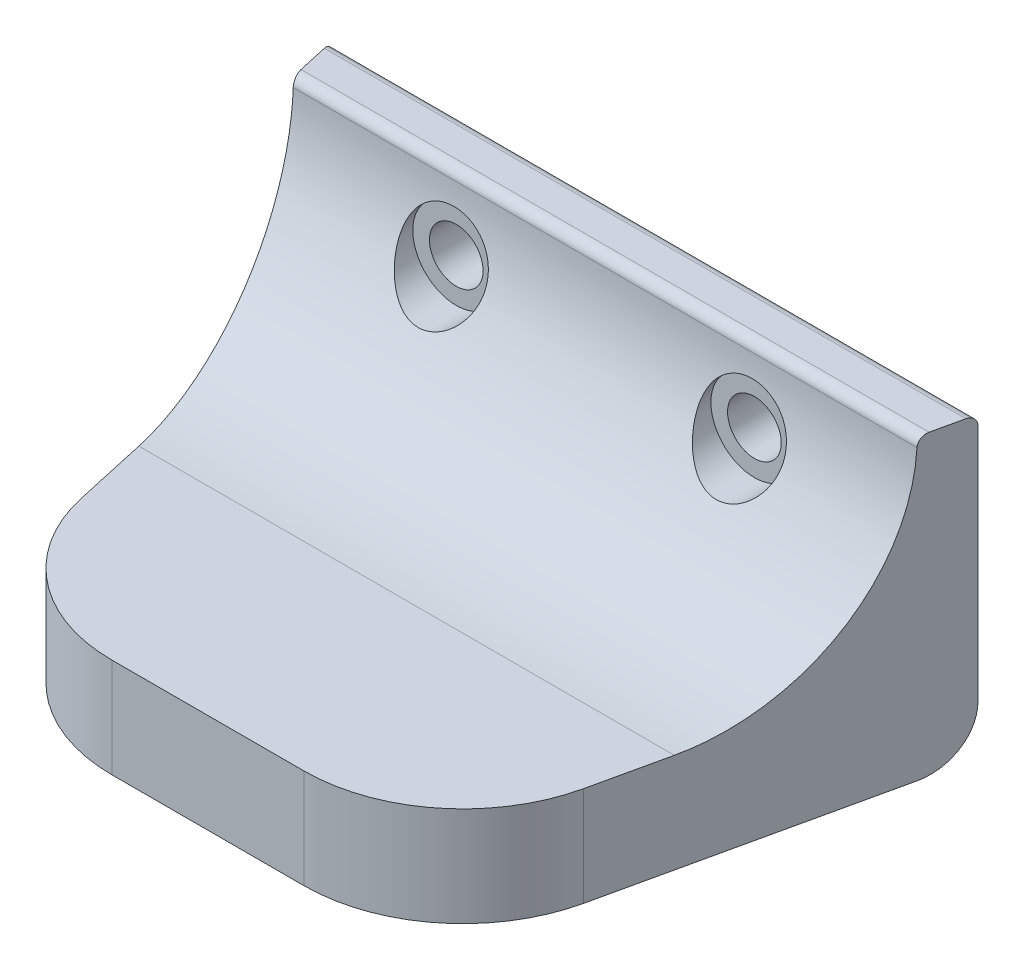
ISO-10303-21;
HEADER;
FILE_DESCRIPTION(('STEP AP214'),'2;1');
FILE_NAME('part.step','',(''),(''),'','','');
FILE_SCHEMA(('AUTOMOTIVE_DESIGN { 1 0 10303 214 1 1 1 1 }'));
ENDSEC;
DATA;
#1=APPLICATION_CONTEXT('core data for automotive mechanical design processes');
#2=APPLICATION_PROTOCOL_DEFINITION('international standard','automotive_design',2000,#1);
#3=PRODUCT_CONTEXT('',#1,'mechanical');
#4=PRODUCT('Part','Part','',(#3));
#5=PRODUCT_RELATED_PRODUCT_CATEGORY('part','',(#4));
#6=PRODUCT_DEFINITION_FORMATION('','',#4);
#7=PRODUCT_DEFINITION_CONTEXT('part definition',#1,'design');
#8=PRODUCT_DEFINITION('design','',#6,#7);
#9=PRODUCT_DEFINITION_SHAPE('','',#8);
#10=(LENGTH_UNIT() NAMED_UNIT(*) SI_UNIT(.MILLI.,.METRE.));
#11=(NAMED_UNIT(*) PLANE_ANGLE_UNIT() SI_UNIT($,.RADIAN.));
#12=(NAMED_UNIT(*) SI_UNIT($,.STERADIAN.) SOLID_ANGLE_UNIT());
#13=UNCERTAINTY_MEASURE_WITH_UNIT(LENGTH_MEASURE(1.E-05),#10,'distance_accuracy_value','');
#14=(GEOMETRIC_REPRESENTATION_CONTEXT(3) GLOBAL_UNCERTAINTY_ASSIGNED_CONTEXT((#13)) GLOBAL_UNIT_ASSIGNED_CONTEXT((#10,
#11,#12)) REPRESENTATION_CONTEXT('',''));
#15=CARTESIAN_POINT('',(0.,0.,0.));
#16=DIRECTION('',(0.,0.,1.));
#17=DIRECTION('',(1.,0.,0.));
#18=AXIS2_PLACEMENT_3D('',#15,#16,#17);
#19=CARTESIAN_POINT('',(0.,12.7,0.));
#20=DIRECTION('',(0.,1.,0.));
#21=DIRECTION('',(0.,0.,1.));
#22=AXIS2_PLACEMENT_3D('',#19,#20,#21);
#23=PLANE('',#22);
#24=DIRECTION('',(1.,0.,0.));
#25=VECTOR('',#24,1.);
#26=CARTESIAN_POINT('',(0.,12.7,28.575));
#27=LINE('',#26,#25);
#28=CARTESIAN_POINT('',(-12.2748729586454,12.7,28.575));
#29=VERTEX_POINT('',#28);
#30=CARTESIAN_POINT('',(12.2748729586454,12.7,28.575));
#31=VERTEX_POINT('',#30);
#32=EDGE_CURVE('E306',#29,#31,#27,.T.);
#33=ORIENTED_EDGE('',*,*,#32,.T.);
#34=CARTESIAN_POINT('',(12.2748729586454,12.7,8.25499999999998));
#35=DIRECTION('',(0.,1.,0.));
#36=DIRECTION('',(0.,0.,1.));
#37=AXIS2_PLACEMENT_3D('',#34,#35,#36);
#38=CIRCLE('',#37,20.32);
#39=CARTESIAN_POINT('',(32.1109940215833,12.7,12.6630269028751));
#40=VERTEX_POINT('',#39);
#41=EDGE_CURVE('E149',#31,#40,#38,.T.);
#42=ORIENTED_EDGE('',*,*,#41,.T.);
#43=DIRECTION('',(0.216930457818656,0.,-0.976187060183953));
#44=VECTOR('',#43,1.);
#45=CARTESIAN_POINT('',(33.2814705882353,12.7,7.39588235294117));
#46=LINE('',#45,#44);
#47=CARTESIAN_POINT('',(34.2194444444444,12.7,3.17499999999999));
#48=VERTEX_POINT('',#47);
#49=EDGE_CURVE('E135',#40,#48,#46,.T.);
#50=ORIENTED_EDGE('',*,*,#49,.T.);
#51=DIRECTION('',(-1.,0.,0.));
#52=VECTOR('',#51,1.);
#53=CARTESIAN_POINT('',(0.,12.7,3.17499999999999));
#54=LINE('',#53,#52);
#55=CARTESIAN_POINT('',(-34.2194444444444,12.7,3.17499999999999));
#56=VERTEX_POINT('',#55);
#57=EDGE_CURVE('E146',#48,#56,#54,.T.);
#58=ORIENTED_EDGE('',*,*,#57,.T.);
#59=DIRECTION('',(0.216930457818656,0.,0.976187060183953));
#60=VECTOR('',#59,1.);
#61=CARTESIAN_POINT('',(-33.2814705882353,12.7,7.39588235294118));
#62=LINE('',#61,#60);
#63=CARTESIAN_POINT('',(-32.1109940215833,12.7,12.6630269028751));
#64=VERTEX_POINT('',#63);
#65=EDGE_CURVE('E150',#56,#64,#62,.T.);
#66=ORIENTED_EDGE('',*,*,#65,.T.);
#67=CARTESIAN_POINT('',(-12.2748729586454,12.7,8.25499999999998));
#68=DIRECTION('',(0.,1.,0.));
#69=DIRECTION('',(0.,0.,1.));
#70=AXIS2_PLACEMENT_3D('',#67,#68,#69);
#71=CIRCLE('',#70,20.32);
#72=EDGE_CURVE('E172',#64,#29,#71,.T.);
#73=ORIENTED_EDGE('',*,*,#72,.T.);
#74=EDGE_LOOP('',(#33,#42,#50,#58,#66,#73));
#75=FACE_BOUND('',#74,.T.);
#76=ADVANCED_FACE('F44',(#75),#23,.T.);
#77=CARTESIAN_POINT('',(33.2814705882353,12.7,7.39588235294117));
#78=DIRECTION('',(-0.976187060183953,0.,-0.216930457818656));
#79=DIRECTION('',(-0.216930457818656,0.,0.976187060183953));
#80=AXIS2_PLACEMENT_3D('',#77,#78,#79);
#81=PLANE('',#80);
#82=DIRECTION('',(0.216930457818656,0.,-0.976187060183953));
#83=VECTOR('',#82,1.);
#84=CARTESIAN_POINT('',(33.2814705882353,38.1,7.39588235294117));
#85=LINE('',#84,#83);
#86=CARTESIAN_POINT('',(40.1393877207826,38.1,-23.4647447435219));
#87=VERTEX_POINT('',#86);
#88=CARTESIAN_POINT('',(40.9927777777778,38.1,-27.305));
#89=VERTEX_POINT('',#88);
#90=EDGE_CURVE('E296',#87,#89,#85,.T.);
#91=ORIENTED_EDGE('',*,*,#90,.F.);
#92=CARTESIAN_POINT('',(40.1393877207826,36.83,-23.4647447435219));
#93=DIRECTION('',(-0.976187060183953,0.,-0.216930457818656));
#94=DIRECTION('',(-0.216930457818656,0.,0.976187060183953));
#95=AXIS2_PLACEMENT_3D('',#92,#93,#94);
#96=ELLIPSE('',#95,1.30098016230688,1.27);
#97=CARTESIAN_POINT('',(39.8574856600046,36.8904761904762,-22.1961854700208));
#98=VERTEX_POINT('',#97);
#99=EDGE_CURVE('E137',#87,#98,#96,.F.);
#100=ORIENTED_EDGE('',*,*,#99,.T.);
#101=CARTESIAN_POINT('',(34.2194444444444,38.1,3.17499999999999));
#102=DIRECTION('',(-0.976187060183953,0.,-0.216930457818656));
#103=DIRECTION('',(-0.216930457818656,0.,0.976187060183953));
#104=AXIS2_PLACEMENT_3D('',#101,#102,#103);
#105=ELLIPSE('',#104,26.0196032461377,25.4);
#106=EDGE_CURVE('E130',#98,#48,#105,.T.);
#107=ORIENTED_EDGE('',*,*,#106,.T.);
#108=ORIENTED_EDGE('',*,*,#49,.F.);
#109=DIRECTION('',(0.,-1.,0.));
#110=VECTOR('',#109,1.);
#111=CARTESIAN_POINT('',(32.1109940215833,12.7,12.6630269028751));
#112=LINE('',#111,#110);
#113=CARTESIAN_POINT('',(32.1109940215833,0.,12.6630269028751));
#114=VERTEX_POINT('',#113);
#115=EDGE_CURVE('E139',#40,#114,#112,.T.);
#116=ORIENTED_EDGE('',*,*,#115,.T.);
#117=DIRECTION('',(0.216930457818656,0.,-0.976187060183953));
#118=VECTOR('',#117,1.);
#119=CARTESIAN_POINT('',(33.2814705882353,0.,7.39588235294117));
#120=LINE('',#119,#118);
#121=CARTESIAN_POINT('',(39.8638888888889,0.,-22.225));
#122=VERTEX_POINT('',#121);
#123=EDGE_CURVE('E299',#114,#122,#120,.T.);
#124=ORIENTED_EDGE('',*,*,#123,.T.);
#125=CARTESIAN_POINT('',(39.8638888888889,6.35,-22.225));
#126=DIRECTION('',(-0.976187060183953,0.,-0.216930457818656));
#127=DIRECTION('',(-0.216930457818656,0.,0.976187060183953));
#128=AXIS2_PLACEMENT_3D('',#125,#126,#127);
#129=ELLIPSE('',#128,6.50490081153443,6.35);
#130=CARTESIAN_POINT('',(41.275,6.35,-28.575));
#131=VERTEX_POINT('',#130);
#132=EDGE_CURVE('E180',#122,#131,#129,.F.);
#133=ORIENTED_EDGE('',*,*,#132,.T.);
#134=DIRECTION('',(0.,-1.,0.));
#135=VECTOR('',#134,1.);
#136=CARTESIAN_POINT('',(41.275,12.7,-28.575));
#137=LINE('',#136,#135);
#138=CARTESIAN_POINT('',(41.275,36.83,-28.575));
#139=VERTEX_POINT('',#138);
#140=EDGE_CURVE('E154',#139,#131,#137,.T.);
#141=ORIENTED_EDGE('',*,*,#140,.F.);
#142=CARTESIAN_POINT('',(40.9927777777778,36.83,-27.305));
#143=DIRECTION('',(-0.976187060183953,0.,-0.216930457818656));
#144=DIRECTION('',(0.216930457818656,0.,-0.976187060183953));
#145=AXIS2_PLACEMENT_3D('',#142,#143,#144);
#146=ELLIPSE('',#145,1.30098016230688,1.27);
#147=EDGE_CURVE('E193',#139,#89,#146,.F.);
#148=ORIENTED_EDGE('',*,*,#147,.T.);
#149=EDGE_LOOP('',(#91,#100,#107,#108,#116,#124,#133,#141,#148));
#150=FACE_BOUND('',#149,.T.);
#151=ADVANCED_FACE('F133',(#150),#81,.F.);
#152=CARTESIAN_POINT('',(0.,12.7,-28.575));
#153=DIRECTION('',(0.,0.,-1.));
#154=DIRECTION('',(-1.,0.,0.));
#155=AXIS2_PLACEMENT_3D('',#152,#153,#154);
#156=PLANE('',#155);
#157=CARTESIAN_POINT('',(19.05,28.702,-28.575));
#158=DIRECTION('',(0.,0.,-1.));
#159=DIRECTION('',(-1.,0.,0.));
#160=AXIS2_PLACEMENT_3D('',#157,#158,#159);
#161=CIRCLE('',#160,3.429);
#162=CARTESIAN_POINT('',(15.621,28.702,-28.575));
#163=VERTEX_POINT('',#162);
#164=EDGE_CURVE('E297',#163,#163,#161,.T.);
#165=ORIENTED_EDGE('',*,*,#164,.F.);
#166=EDGE_LOOP('',(#165));
#167=FACE_BOUND('',#166,.T.);
#168=CARTESIAN_POINT('',(-19.05,28.702,-28.575));
#169=DIRECTION('',(0.,0.,-1.));
#170=DIRECTION('',(1.,0.,0.));
#171=AXIS2_PLACEMENT_3D('',#168,#169,#170);
#172=CIRCLE('',#171,3.429);
#173=CARTESIAN_POINT('',(-15.621,28.702,-28.575));
#174=VERTEX_POINT('',#173);
#175=EDGE_CURVE('E204',#174,#174,#172,.T.);
#176=ORIENTED_EDGE('',*,*,#175,.F.);
#177=EDGE_LOOP('',(#176));
#178=FACE_BOUND('',#177,.T.);
#179=DIRECTION('',(0.,-1.,0.));
#180=VECTOR('',#179,1.);
#181=CARTESIAN_POINT('',(-41.275,12.7,-28.575));
#182=LINE('',#181,#180);
#183=CARTESIAN_POINT('',(-41.275,36.83,-28.575));
#184=VERTEX_POINT('',#183);
#185=CARTESIAN_POINT('',(-41.275,6.35,-28.575));
#186=VERTEX_POINT('',#185);
#187=EDGE_CURVE('E157',#184,#186,#182,.T.);
#188=ORIENTED_EDGE('',*,*,#187,.F.);
#189=DIRECTION('',(1.,0.,0.));
#190=VECTOR('',#189,1.);
#191=CARTESIAN_POINT('',(0.,36.83,-28.575));
#192=LINE('',#191,#190);
#193=EDGE_CURVE('E11',#184,#139,#192,.T.);
#194=ORIENTED_EDGE('',*,*,#193,.T.);
#195=ORIENTED_EDGE('',*,*,#140,.T.);
#196=DIRECTION('',(1.,0.,0.));
#197=VECTOR('',#196,1.);
#198=CARTESIAN_POINT('',(-41.275,6.35,-28.575));
#199=LINE('',#198,#197);
#200=EDGE_CURVE('E183',#131,#186,#199,.F.);
#201=ORIENTED_EDGE('',*,*,#200,.T.);
#202=EDGE_LOOP('',(#188,#194,#195,#201));
#203=FACE_BOUND('',#202,.T.);
#204=ADVANCED_FACE('F248',(#167,#178,#203),#156,.T.);
#205=CARTESIAN_POINT('',(-33.2814705882353,12.7,7.39588235294118));
#206=DIRECTION('',(0.976187060183953,0.,-0.216930457818656));
#207=DIRECTION('',(-0.216930457818656,0.,-0.976187060183953));
#208=AXIS2_PLACEMENT_3D('',#205,#206,#207);
#209=PLANE('',#208);
#210=CARTESIAN_POINT('',(-34.2194444444444,38.1,3.17499999999999));
#211=DIRECTION('',(0.976187060183953,0.,-0.216930457818656));
#212=DIRECTION('',(-0.216930457818656,0.,-0.976187060183953));
#213=AXIS2_PLACEMENT_3D('',#210,#211,#212);
#214=ELLIPSE('',#213,26.0196032461377,25.4);
#215=CARTESIAN_POINT('',(-39.8574856600046,36.8904761904762,-22.1961854700208));
#216=VERTEX_POINT('',#215);
#217=EDGE_CURVE('E140',#56,#216,#214,.T.);
#218=ORIENTED_EDGE('',*,*,#217,.T.);
#219=CARTESIAN_POINT('',(-40.1393877207826,36.83,-23.4647447435219));
#220=DIRECTION('',(0.976187060183953,0.,-0.216930457818656));
#221=DIRECTION('',(-0.216930457818656,0.,-0.976187060183953));
#222=AXIS2_PLACEMENT_3D('',#219,#220,#221);
#223=ELLIPSE('',#222,1.30098016230688,1.27);
#224=CARTESIAN_POINT('',(-40.1393877207826,38.1,-23.4647447435219));
#225=VERTEX_POINT('',#224);
#226=EDGE_CURVE('E53',#216,#225,#223,.F.);
#227=ORIENTED_EDGE('',*,*,#226,.T.);
#228=DIRECTION('',(0.216930457818656,0.,0.976187060183953));
#229=VECTOR('',#228,1.);
#230=CARTESIAN_POINT('',(-33.2814705882353,38.1,7.39588235294118));
#231=LINE('',#230,#229);
#232=CARTESIAN_POINT('',(-40.9927777777778,38.1,-27.305));
#233=VERTEX_POINT('',#232);
#234=EDGE_CURVE('E292',#233,#225,#231,.T.);
#235=ORIENTED_EDGE('',*,*,#234,.F.);
#236=CARTESIAN_POINT('',(-40.9927777777778,36.83,-27.305));
#237=DIRECTION('',(0.976187060183953,0.,-0.216930457818656));
#238=DIRECTION('',(0.216930457818656,0.,0.976187060183953));
#239=AXIS2_PLACEMENT_3D('',#236,#237,#238);
#240=ELLIPSE('',#239,1.30098016230688,1.27);
#241=EDGE_CURVE('E61',#233,#184,#240,.F.);
#242=ORIENTED_EDGE('',*,*,#241,.T.);
#243=ORIENTED_EDGE('',*,*,#187,.T.);
#244=CARTESIAN_POINT('',(-39.8638888888889,6.35,-22.225));
#245=DIRECTION('',(0.976187060183953,0.,-0.216930457818656));
#246=DIRECTION('',(-0.216930457818656,0.,-0.976187060183953));
#247=AXIS2_PLACEMENT_3D('',#244,#245,#246);
#248=ELLIPSE('',#247,6.50490081153443,6.35);
#249=CARTESIAN_POINT('',(-39.8638888888889,0.,-22.225));
#250=VERTEX_POINT('',#249);
#251=EDGE_CURVE('E186',#186,#250,#248,.F.);
#252=ORIENTED_EDGE('',*,*,#251,.T.);
#253=DIRECTION('',(0.216930457818656,0.,0.976187060183953));
#254=VECTOR('',#253,1.);
#255=CARTESIAN_POINT('',(-33.2814705882353,0.,7.39588235294118));
#256=LINE('',#255,#254);
#257=CARTESIAN_POINT('',(-32.1109940215833,0.,12.6630269028751));
#258=VERTEX_POINT('',#257);
#259=EDGE_CURVE('E310',#250,#258,#256,.T.);
#260=ORIENTED_EDGE('',*,*,#259,.T.);
#261=DIRECTION('',(0.,-1.,0.));
#262=VECTOR('',#261,1.);
#263=CARTESIAN_POINT('',(-32.1109940215833,12.7,12.6630269028751));
#264=LINE('',#263,#262);
#265=EDGE_CURVE('E175',#258,#64,#264,.F.);
#266=ORIENTED_EDGE('',*,*,#265,.T.);
#267=ORIENTED_EDGE('',*,*,#65,.F.);
#268=EDGE_LOOP('',(#218,#227,#235,#242,#243,#252,#260,#266,#267));
#269=FACE_BOUND('',#268,.T.);
#270=ADVANCED_FACE('F261',(#269),#209,.F.);
#271=CARTESIAN_POINT('',(0.,12.7,28.575));
#272=DIRECTION('',(0.,0.,-1.));
#273=DIRECTION('',(-1.,0.,0.));
#274=AXIS2_PLACEMENT_3D('',#271,#272,#273);
#275=PLANE('',#274);
#276=DIRECTION('',(1.,0.,0.));
#277=VECTOR('',#276,1.);
#278=CARTESIAN_POINT('',(0.,0.,28.575));
#279=LINE('',#278,#277);
#280=CARTESIAN_POINT('',(-12.2748729586454,0.,28.575));
#281=VERTEX_POINT('',#280);
#282=CARTESIAN_POINT('',(12.2748729586454,0.,28.575));
#283=VERTEX_POINT('',#282);
#284=EDGE_CURVE('E151',#281,#283,#279,.T.);
#285=ORIENTED_EDGE('',*,*,#284,.T.);
#286=DIRECTION('',(0.,-1.,0.));
#287=VECTOR('',#286,1.);
#288=CARTESIAN_POINT('',(12.2748729586454,12.7,28.575));
#289=LINE('',#288,#287);
#290=EDGE_CURVE('E170',#283,#31,#289,.F.);
#291=ORIENTED_EDGE('',*,*,#290,.T.);
#292=ORIENTED_EDGE('',*,*,#32,.F.);
#293=DIRECTION('',(0.,-1.,0.));
#294=VECTOR('',#293,1.);
#295=CARTESIAN_POINT('',(-12.2748729586454,12.7,28.575));
#296=LINE('',#295,#294);
#297=EDGE_CURVE('E167',#29,#281,#296,.T.);
#298=ORIENTED_EDGE('',*,*,#297,.T.);
#299=EDGE_LOOP('',(#285,#291,#292,#298));
#300=FACE_BOUND('',#299,.T.);
#301=ADVANCED_FACE('F257',(#300),#275,.F.);
#302=CARTESIAN_POINT('',(0.,0.,0.));
#303=DIRECTION('',(0.,1.,0.));
#304=DIRECTION('',(0.,0.,1.));
#305=AXIS2_PLACEMENT_3D('',#302,#303,#304);
#306=PLANE('',#305);
#307=ORIENTED_EDGE('',*,*,#259,.F.);
#308=DIRECTION('',(1.,0.,0.));
#309=VECTOR('',#308,1.);
#310=CARTESIAN_POINT('',(41.275,0.,-22.225));
#311=LINE('',#310,#309);
#312=EDGE_CURVE('E177',#250,#122,#311,.T.);
#313=ORIENTED_EDGE('',*,*,#312,.T.);
#314=ORIENTED_EDGE('',*,*,#123,.F.);
#315=CARTESIAN_POINT('',(12.2748729586454,0.,8.25499999999998));
#316=DIRECTION('',(0.,1.,0.));
#317=DIRECTION('',(0.,0.,1.));
#318=AXIS2_PLACEMENT_3D('',#315,#316,#317);
#319=CIRCLE('',#318,20.32);
#320=EDGE_CURVE('E165',#114,#283,#319,.F.);
#321=ORIENTED_EDGE('',*,*,#320,.T.);
#322=ORIENTED_EDGE('',*,*,#284,.F.);
#323=CARTESIAN_POINT('',(-12.2748729586454,0.,8.25499999999998));
#324=DIRECTION('',(0.,1.,0.));
#325=DIRECTION('',(0.,0.,1.));
#326=AXIS2_PLACEMENT_3D('',#323,#324,#325);
#327=CIRCLE('',#326,20.32);
#328=EDGE_CURVE('E162',#281,#258,#327,.F.);
#329=ORIENTED_EDGE('',*,*,#328,.T.);
#330=EDGE_LOOP('',(#307,#313,#314,#321,#322,#329));
#331=FACE_BOUND('',#330,.T.);
#332=ADVANCED_FACE('F254',(#331),#306,.F.);
#333=CARTESIAN_POINT('',(0.,38.1,0.));
#334=DIRECTION('',(0.,1.,0.));
#335=DIRECTION('',(0.,0.,1.));
#336=AXIS2_PLACEMENT_3D('',#333,#334,#335);
#337=PLANE('',#336);
#338=ORIENTED_EDGE('',*,*,#234,.T.);
#339=DIRECTION('',(1.,0.,0.));
#340=VECTOR('',#339,1.);
#341=CARTESIAN_POINT('',(39.8638888888889,38.1,-23.4647447435219));
#342=LINE('',#341,#340);
#343=EDGE_CURVE('E190',#225,#87,#342,.T.);
#344=ORIENTED_EDGE('',*,*,#343,.T.);
#345=ORIENTED_EDGE('',*,*,#90,.T.);
#346=DIRECTION('',(1.,0.,0.));
#347=VECTOR('',#346,1.);
#348=CARTESIAN_POINT('',(0.,38.1,-27.305));
#349=LINE('',#348,#347);
#350=EDGE_CURVE('E188',#89,#233,#349,.F.);
#351=ORIENTED_EDGE('',*,*,#350,.T.);
#352=EDGE_LOOP('',(#338,#344,#345,#351));
#353=FACE_BOUND('',#352,.T.);
#354=ADVANCED_FACE('F252',(#353),#337,.T.);
#355=CARTESIAN_POINT('',(0.,38.1,3.17499999999999));
#356=DIRECTION('',(-1.,0.,0.));
#357=DIRECTION('',(0.,0.,1.));
#358=AXIS2_PLACEMENT_3D('',#355,#356,#357);
#359=CYLINDRICAL_SURFACE('',#358,25.4);
#360=CARTESIAN_POINT('',(13.49375,28.702,-20.4224065524159));
#361=CARTESIAN_POINT('',(13.4937444494878,28.5302184618122,-20.3539959532494));
#362=CARTESIAN_POINT('',(13.5017148638482,28.3592541904367,-20.2837264938944));
#363=CARTESIAN_POINT('',(13.5331301185644,28.0200504016366,-20.1399844292932));
#364=CARTESIAN_POINT('',(13.5565780487582,27.8518114351477,-20.0665111871991));
#365=CARTESIAN_POINT('',(13.6184701275267,27.5191898144611,-19.9169843758128));
#366=CARTESIAN_POINT('',(13.6569225163623,27.3548093319745,-19.840929409661));
#367=CARTESIAN_POINT('',(13.7483147894845,27.0309615228968,-19.6869455063896));
#368=CARTESIAN_POINT('',(13.8012599585243,26.8714960121824,-19.6090158951592));
#369=CARTESIAN_POINT('',(13.9209736189234,26.558888429348,-19.4522669284419));
#370=CARTESIAN_POINT('',(13.9877038763128,26.4057302434337,-19.3734505922408));
#371=CARTESIAN_POINT('',(14.1345563425359,26.1061980982511,-19.2155665433379));
#372=CARTESIAN_POINT('',(14.2146786243542,25.9598241759615,-19.1364988292684));
#373=CARTESIAN_POINT('',(14.4746963441058,25.5318593076544,-18.9000428880382));
#374=CARTESIAN_POINT('',(14.6742795747111,25.2613290628421,-18.7433531241214));
#375=CARTESIAN_POINT('',(15.0135795293002,24.8797574720787,-18.5139016749672));
#376=CARTESIAN_POINT('',(15.1355753101583,24.7548529014055,-18.4371952439769));
#377=CARTESIAN_POINT('',(15.3922149746672,24.515925334156,-18.2878208923157));
#378=CARTESIAN_POINT('',(15.5268604070064,24.4019036734209,-18.2151534678756));
#379=CARTESIAN_POINT('',(15.8080140313002,24.1861600513116,-18.0754489563039));
#380=CARTESIAN_POINT('',(15.9545045283568,24.0844202892612,-18.0084037647667));
#381=CARTESIAN_POINT('',(16.2588194257235,23.8943634582273,-17.8814228593499));
#382=CARTESIAN_POINT('',(16.4166391018655,23.8060408417406,-17.8214842094355));
#383=CARTESIAN_POINT('',(16.6973776052897,23.6666869849142,-17.7258255909475));
#384=CARTESIAN_POINT('',(16.8178323138342,23.6121078917917,-17.6879999027999));
#385=CARTESIAN_POINT('',(17.0636387481768,23.5112467075538,-17.6175962668331));
#386=CARTESIAN_POINT('',(17.1889893092254,23.4649626574715,-17.5850170801789));
#387=CARTESIAN_POINT('',(17.4439030775,23.38125248704,-17.5257513000577));
#388=CARTESIAN_POINT('',(17.5734640592822,23.3438217711094,-17.4990616499394));
#389=CARTESIAN_POINT('',(17.8360175501231,23.2783060794521,-17.4521426801464));
#390=CARTESIAN_POINT('',(17.9690084113732,23.2502167028046,-17.4319103184754));
#391=CARTESIAN_POINT('',(18.2382611051441,23.2036587287409,-17.3982799824167));
#392=CARTESIAN_POINT('',(18.3745365301234,23.185241867996,-17.3849187684126));
#393=CARTESIAN_POINT('',(18.6486001068515,23.1585582446874,-17.3655353445589));
#394=CARTESIAN_POINT('',(18.7863882525643,23.1502914416374,-17.3595131054358));
#395=CARTESIAN_POINT('',(19.0623115778357,23.144050396433,-17.3549680175706));
#396=CARTESIAN_POINT('',(19.2004467304546,23.1460753785456,-17.3564446036123));
#397=CARTESIAN_POINT('',(19.4758940982375,23.160380411175,-17.3668559035917));
#398=CARTESIAN_POINT('',(19.6132063520592,23.1726599760927,-17.3757902643714));
#399=CARTESIAN_POINT('',(19.8751005473088,23.2058976981353,-17.3998900471001));
#400=CARTESIAN_POINT('',(19.9998307450887,23.2260930504078,-17.4145070533208));
#401=CARTESIAN_POINT('',(20.2468592900027,23.2747249297016,-17.4495510743075));
#402=CARTESIAN_POINT('',(20.3691568017904,23.3031642370921,-17.4699800491838));
#403=CARTESIAN_POINT('',(20.7312360944386,23.4003324938538,-17.5393955336426));
#404=CARTESIAN_POINT('',(20.9663986527133,23.4809370698392,-17.596529358159));
#405=CARTESIAN_POINT('',(21.4336723019828,23.6762440358842,-17.7326586021627));
#406=CARTESIAN_POINT('',(21.6646752106976,23.7927618347328,-17.8127966757884));
#407=CARTESIAN_POINT('',(22.1042179562357,24.0534504216498,-17.9881549218744));
#408=CARTESIAN_POINT('',(22.3127469048331,24.1976345203216,-18.0833823501549));
#409=CARTESIAN_POINT('',(22.7383314099591,24.5361898495941,-18.3012656070316));
#410=CARTESIAN_POINT('',(22.9509309250341,24.7349231506223,-18.4258414857707));
#411=CARTESIAN_POINT('',(23.340642560672,25.1600302930331,-18.6831567286418));
#412=CARTESIAN_POINT('',(23.5177300463383,25.3864231480057,-18.8159016768491));
#413=CARTESIAN_POINT('',(23.8588610708574,25.8992066040696,-19.10503568775));
#414=CARTESIAN_POINT('',(24.0166932174883,26.1894673190834,-19.2619170459637));
#415=CARTESIAN_POINT('',(24.2791001726132,26.7948660296044,-19.5729567699174));
#416=CARTESIAN_POINT('',(24.3836539480558,27.110013793318,-19.7271140371031));
#417=CARTESIAN_POINT('',(24.4991569989947,27.6025596043597,-19.9550382493694));
#418=CARTESIAN_POINT('',(24.5309612839373,27.7738196268392,-20.0320190608031));
#419=CARTESIAN_POINT('',(24.5784261518855,28.1198676354193,-20.1829212169865));
#420=CARTESIAN_POINT('',(24.5940931017413,28.2946542023782,-20.2568437572937));
#421=CARTESIAN_POINT('',(24.6087607196784,28.646427587925,-20.4009648428496));
#422=CARTESIAN_POINT('',(24.6077630498664,28.8234141853253,-20.471163758787));
#423=CARTESIAN_POINT('',(24.588660224479,29.1781197205706,-20.6072647606673));
#424=CARTESIAN_POINT('',(24.5705565715002,29.3558385927272,-20.673167223469));
#425=CARTESIAN_POINT('',(24.5186525396322,29.6989406587076,-20.7960919778595));
#426=CARTESIAN_POINT('',(24.4859378064502,29.864381385057,-20.8534128245691));
#427=CARTESIAN_POINT('',(24.4051355907932,30.192992163263,-20.9635427699406));
#428=CARTESIAN_POINT('',(24.3570495397597,30.3561624250788,-21.0163522881362));
#429=CARTESIAN_POINT('',(24.245571212638,30.678624489695,-21.1172151566632));
#430=CARTESIAN_POINT('',(24.1821853247146,30.8379178807338,-21.1652704802453));
#431=CARTESIAN_POINT('',(24.0403323907794,31.151089354877,-21.2565214147791));
#432=CARTESIAN_POINT('',(23.961866476914,31.3049678434848,-21.2997173901651));
#433=CARTESIAN_POINT('',(23.7975698769529,31.5929523798542,-21.3777733172751));
#434=CARTESIAN_POINT('',(23.7129256370157,31.7276292979619,-21.4130294249883));
#435=CARTESIAN_POINT('',(23.5318699575894,31.9898776342866,-21.4795067283909));
#436=CARTESIAN_POINT('',(23.4354593125187,32.1174495313589,-21.5107281961897));
#437=CARTESIAN_POINT('',(23.2315208670606,32.3642977694814,-21.5692480717996));
#438=CARTESIAN_POINT('',(23.1239952203636,32.4835757101401,-21.5965472371721));
#439=CARTESIAN_POINT('',(22.8985735052308,32.7127641848023,-21.647398605979));
#440=CARTESIAN_POINT('',(22.7806776267794,32.8226748903426,-21.670950878035));
#441=CARTESIAN_POINT('',(22.5408659679965,33.0274494095534,-21.7135451505716));
#442=CARTESIAN_POINT('',(22.4193632538718,33.1227654190697,-21.7327413379586));
#443=CARTESIAN_POINT('',(22.1685053971795,33.3031643422719,-21.7681117237004));
#444=CARTESIAN_POINT('',(22.0391476375705,33.3882438170235,-21.7842849074902));
#445=CARTESIAN_POINT('',(21.7735993710519,33.5473970631727,-21.8138046479373));
#446=CARTESIAN_POINT('',(21.6374117631864,33.6214754521513,-21.8271523915476));
#447=CARTESIAN_POINT('',(21.3590828790599,33.7580945301384,-21.8512396904367));
#448=CARTESIAN_POINT('',(21.2169394234111,33.8206309496137,-21.861978281017));
#449=CARTESIAN_POINT('',(20.9291545028459,33.933092832314,-21.880939564784));
#450=CARTESIAN_POINT('',(20.7835592704566,33.9831327742416,-21.8891852543072));
#451=CARTESIAN_POINT('',(20.488564218158,34.0709981557545,-21.9034594415903));
#452=CARTESIAN_POINT('',(20.3391630251832,34.1088191178314,-21.9094871266996));
#453=CARTESIAN_POINT('',(20.0377234217463,34.1719195643636,-21.91944570674));
#454=CARTESIAN_POINT('',(19.8856859849847,34.1972035813691,-21.9233773594998));
#455=CARTESIAN_POINT('',(19.5799418857554,34.2350654021093,-21.9292356686933));
#456=CARTESIAN_POINT('',(19.4262346269083,34.247638504518,-21.931161583282));
#457=CARTESIAN_POINT('',(19.1181181694047,34.259973829915,-21.9330512653079));
#458=CARTESIAN_POINT('',(18.9637083678561,34.2597213428014,-21.9330127797081));
#459=CARTESIAN_POINT('',(18.6554013137149,34.2463685845579,-21.9309668255448));
#460=CARTESIAN_POINT('',(18.5015042715956,34.2332635661083,-21.9289586294325));
#461=CARTESIAN_POINT('',(18.1954287309001,34.1943047878667,-21.9229268573366));
#462=CARTESIAN_POINT('',(18.0432496246942,34.1684556899781,-21.9189040183198));
#463=CARTESIAN_POINT('',(17.7415817804768,34.1041988097244,-21.90875229722));
#464=CARTESIAN_POINT('',(17.5920940553397,34.0657863993749,-21.9026226389996));
#465=CARTESIAN_POINT('',(17.2969083115203,33.9766886063725,-21.888127115748));
#466=CARTESIAN_POINT('',(17.151210595668,33.9260022463196,-21.8797610726235));
#467=CARTESIAN_POINT('',(16.8646465996831,33.8127659578531,-21.8606327817902));
#468=CARTESIAN_POINT('',(16.7237821227582,33.7502116573203,-21.8498696507453));
#469=CARTESIAN_POINT('',(16.3100962783916,33.5454744253764,-21.8137093319767));
#470=CARTESIAN_POINT('',(16.045847138806,33.3861154278135,-21.7844258076545));
#471=CARTESIAN_POINT('',(15.5489080775903,33.0272933406503,-21.7139706835422));
#472=CARTESIAN_POINT('',(15.3161611383935,32.8279043735859,-21.67282099548));
#473=CARTESIAN_POINT('',(14.8877886625663,32.3953057850482,-21.5770790537591));
#474=CARTESIAN_POINT('',(14.6921630282873,32.1620962525435,-21.5224868354623));
#475=CARTESIAN_POINT('',(14.3423474805806,31.6687659519023,-21.3986449791199));
#476=CARTESIAN_POINT('',(14.1882964479409,31.40855890889,-21.3293475619002));
#477=CARTESIAN_POINT('',(13.9255525998193,30.8703201077463,-21.175973445107));
#478=CARTESIAN_POINT('',(13.8168522871448,30.5922913046086,-21.0918991916475));
#479=CARTESIAN_POINT('',(13.6516325311728,30.0457333252295,-20.9157816560958));
#480=CARTESIAN_POINT('',(13.5921191174983,29.77780532373,-20.8246424707175));
#481=CARTESIAN_POINT('',(13.5131758336764,29.2399223856961,-20.6313144684323));
#482=CARTESIAN_POINT('',(13.4937586583994,28.9699668343615,-20.5291221627708));
#483=CARTESIAN_POINT('',(13.49375,28.702,-20.4224065524159));
#484=B_SPLINE_CURVE_WITH_KNOTS('',3,(#360,#361,#362,#363,#364,#365,#366,#367,#368,#369,#370,
#371,#372,#373,#374,#375,#376,#377,#378,#379,#380,#381,#382,#383,#384,#385,#386,#387,#388,#389,
#390,#391,#392,#393,#394,#395,#396,#397,#398,#399,#400,#401,#402,#403,#404,#405,#406,#407,#408,
#409,#410,#411,#412,#413,#414,#415,#416,#417,#418,#419,#420,#421,#422,#423,#424,#425,#426,#427,
#428,#429,#430,#431,#432,#433,#434,#435,#436,#437,#438,#439,#440,#441,#442,#443,#444,#445,#446,
#447,#448,#449,#450,#451,#452,#453,#454,#455,#456,#457,#458,#459,#460,#461,#462,#463,#464,#465,
#466,#467,#468,#469,#470,#471,#472,#473,#474,#475,#476,#477,#478,#479,#480,#481,#482,#483),
.UNSPECIFIED.,.T.,.F.,(4,2,2,2,2,2,2,2,2,2,2,2,2,2,2,2,2,2,2,2,2,2,2,2,2,2,2,2,2,2,2,2,2,2,2,2,
2,2,2,2,2,2,2,2,2,2,2,2,2,2,2,2,2,2,2,2,2,2,2,2,2,4),(0.,0.554411284354991,1.10893328152433,
1.66376024481475,2.21878979439006,2.77230011342498,3.32581344910994,4.43250192147735,
5.00402856651469,5.57562527458657,6.14638333553955,6.71690476263735,7.12914978489855,
7.54129732224212,7.95323045054875,8.36496923178656,8.77888846472409,9.19280604662179,
9.60669243036168,10.0205592158961,10.4017087278237,10.7829869366843,11.5449605193214,
12.354530715567,13.1644913872177,14.1105648058908,15.05729226787,16.1498552224192,
17.242849161696,17.8135513308577,18.3840282479184,18.9544482667186,19.5248181842459,
20.0584659541407,20.5920640429923,21.1254397220247,21.6587753730323,22.1469445065452,
22.6350806991419,23.1231224850412,23.6111553317906,24.0774466064274,24.5438940954542,
25.0101452416731,25.4765685164201,25.9385477615941,26.4006961023788,26.8626772381006,
27.3248291821585,27.7875111958461,28.2503641740671,28.7130479618322,29.175902382116,
29.6387936725834,30.1018558233231,31.02694107739,31.9503289152984,32.8737143241759,
33.8001471760368,34.726426813119,35.5909948200334,36.4558365158882),.UNSPECIFIED.);
#485=CARTESIAN_POINT('',(13.49375,28.702,-20.4224065524159));
#486=VERTEX_POINT('',#485);
#487=EDGE_CURVE('E200',#486,#486,#484,.T.);
#488=ORIENTED_EDGE('',*,*,#487,.F.);
#489=EDGE_LOOP('',(#488));
#490=FACE_BOUND('',#489,.T.);
#491=CARTESIAN_POINT('',(-24.60625,28.702,-20.4224065524159));
#492=CARTESIAN_POINT('',(-24.6062555505122,28.5302184618122,-20.3539959532494));
#493=CARTESIAN_POINT('',(-24.5982851361518,28.3592541904367,-20.2837264938944));
#494=CARTESIAN_POINT('',(-24.5668698814356,28.0200504016366,-20.1399844292932));
#495=CARTESIAN_POINT('',(-24.5434219512418,27.8518114351477,-20.0665111871991));
#496=CARTESIAN_POINT('',(-24.4815298724733,27.5191898144611,-19.9169843758128));
#497=CARTESIAN_POINT('',(-24.4430774836378,27.3548093319745,-19.8409294096609));
#498=CARTESIAN_POINT('',(-24.3516852105155,27.0309615228968,-19.6869455063896));
#499=CARTESIAN_POINT('',(-24.2987400414757,26.8714960121824,-19.6090158951592));
#500=CARTESIAN_POINT('',(-24.1790263810766,26.558888429348,-19.4522669284419));
#501=CARTESIAN_POINT('',(-24.1122961236872,26.4057302434337,-19.3734505922408));
#502=CARTESIAN_POINT('',(-23.9654436574642,26.1061980982511,-19.2155665433379));
#503=CARTESIAN_POINT('',(-23.8853213756458,25.9598241759615,-19.1364988292684));
#504=CARTESIAN_POINT('',(-23.6253036558942,25.5318593076544,-18.9000428880382));
#505=CARTESIAN_POINT('',(-23.4257204252889,25.2613290628421,-18.7433531241214));
#506=CARTESIAN_POINT('',(-23.0864204706998,24.8797574720787,-18.5139016749672));
#507=CARTESIAN_POINT('',(-22.9644246898417,24.7548529014055,-18.4371952439769));
#508=CARTESIAN_POINT('',(-22.7077850253328,24.515925334156,-18.2878208923157));
#509=CARTESIAN_POINT('',(-22.5731395929936,24.4019036734209,-18.2151534678756));
#510=CARTESIAN_POINT('',(-22.2919859686998,24.1861600513116,-18.0754489563038));
#511=CARTESIAN_POINT('',(-22.1454954716432,24.0844202892612,-18.0084037647667));
#512=CARTESIAN_POINT('',(-21.8411805742766,23.8943634582273,-17.8814228593499));
#513=CARTESIAN_POINT('',(-21.6833608981345,23.8060408417406,-17.8214842094355));
#514=CARTESIAN_POINT('',(-21.4026223947103,23.6666869849142,-17.7258255909475));
#515=CARTESIAN_POINT('',(-21.2821676861658,23.6121078917917,-17.6879999027999));
#516=CARTESIAN_POINT('',(-21.0363612518232,23.5112467075538,-17.6175962668331));
#517=CARTESIAN_POINT('',(-20.9110106907746,23.4649626574715,-17.5850170801788));
#518=CARTESIAN_POINT('',(-20.6560969225,23.38125248704,-17.5257513000577));
#519=CARTESIAN_POINT('',(-20.5265359407178,23.3438217711094,-17.4990616499394));
#520=CARTESIAN_POINT('',(-20.2639824498769,23.2783060794521,-17.4521426801464));
#521=CARTESIAN_POINT('',(-20.1309915886268,23.2502167028046,-17.4319103184754));
#522=CARTESIAN_POINT('',(-19.8617388948559,23.2036587287409,-17.3982799824167));
#523=CARTESIAN_POINT('',(-19.7254634698766,23.185241867996,-17.3849187684126));
#524=CARTESIAN_POINT('',(-19.4513998931485,23.1585582446874,-17.3655353445589));
#525=CARTESIAN_POINT('',(-19.3136117474357,23.1502914416374,-17.3595131054357));
#526=CARTESIAN_POINT('',(-19.0376884221643,23.144050396433,-17.3549680175706));
#527=CARTESIAN_POINT('',(-18.8995532695454,23.1460753785456,-17.3564446036123));
#528=CARTESIAN_POINT('',(-18.6241059017625,23.160380411175,-17.3668559035917));
#529=CARTESIAN_POINT('',(-18.4867936479408,23.1726599760927,-17.3757902643714));
#530=CARTESIAN_POINT('',(-18.2248994526912,23.2058976981353,-17.3998900471001));
#531=CARTESIAN_POINT('',(-18.1001692549113,23.2260930504078,-17.4145070533208));
#532=CARTESIAN_POINT('',(-17.8531407099973,23.2747249297016,-17.4495510743075));
#533=CARTESIAN_POINT('',(-17.7308431982096,23.3031642370921,-17.4699800491838));
#534=CARTESIAN_POINT('',(-17.3687639055614,23.4003324938538,-17.5393955336426));
#535=CARTESIAN_POINT('',(-17.1336013472866,23.4809370698392,-17.596529358159));
#536=CARTESIAN_POINT('',(-16.6663276980172,23.6762440358842,-17.7326586021626));
#537=CARTESIAN_POINT('',(-16.4353247893023,23.7927618347328,-17.8127966757884));
#538=CARTESIAN_POINT('',(-15.9957820437643,24.0534504216498,-17.9881549218744));
#539=CARTESIAN_POINT('',(-15.7872530951669,24.1976345203216,-18.0833823501548));
#540=CARTESIAN_POINT('',(-15.3616685900409,24.5361898495941,-18.3012656070316));
#541=CARTESIAN_POINT('',(-15.1490690749659,24.7349231506223,-18.4258414857707));
#542=CARTESIAN_POINT('',(-14.759357439328,25.1600302930331,-18.6831567286418));
#543=CARTESIAN_POINT('',(-14.5822699536617,25.3864231480057,-18.8159016768491));
#544=CARTESIAN_POINT('',(-14.2411389291426,25.8992066040696,-19.10503568775));
#545=CARTESIAN_POINT('',(-14.0833067825117,26.1894673190834,-19.2619170459637));
#546=CARTESIAN_POINT('',(-13.8208998273868,26.7948660296044,-19.5729567699174));
#547=CARTESIAN_POINT('',(-13.7163460519442,27.110013793318,-19.7271140371031));
#548=CARTESIAN_POINT('',(-13.6008430010053,27.6025596043597,-19.9550382493694));
#549=CARTESIAN_POINT('',(-13.5690387160627,27.7738196268392,-20.0320190608031));
#550=CARTESIAN_POINT('',(-13.5215738481145,28.1198676354193,-20.1829212169865));
#551=CARTESIAN_POINT('',(-13.5059068982587,28.2946542023782,-20.2568437572937));
#552=CARTESIAN_POINT('',(-13.4912392803216,28.646427587925,-20.4009648428496));
#553=CARTESIAN_POINT('',(-13.4922369501336,28.8234141853253,-20.471163758787));
#554=CARTESIAN_POINT('',(-13.511339775521,29.1781197205706,-20.6072647606673));
#555=CARTESIAN_POINT('',(-13.5294434284998,29.3558385927272,-20.673167223469));
#556=CARTESIAN_POINT('',(-13.5813474603678,29.6989406587076,-20.7960919778595));
#557=CARTESIAN_POINT('',(-13.6140621935498,29.864381385057,-20.8534128245691));
#558=CARTESIAN_POINT('',(-13.6948644092068,30.192992163263,-20.9635427699406));
#559=CARTESIAN_POINT('',(-13.7429504602404,30.3561624250789,-21.0163522881362));
#560=CARTESIAN_POINT('',(-13.854428787362,30.678624489695,-21.1172151566632));
#561=CARTESIAN_POINT('',(-13.9178146752854,30.8379178807338,-21.1652704802453));
#562=CARTESIAN_POINT('',(-14.0596676092206,31.151089354877,-21.2565214147791));
#563=CARTESIAN_POINT('',(-14.138133523086,31.3049678434848,-21.2997173901651));
#564=CARTESIAN_POINT('',(-14.3024301230471,31.5929523798542,-21.3777733172751));
#565=CARTESIAN_POINT('',(-14.3870743629843,31.7276292979619,-21.4130294249883));
#566=CARTESIAN_POINT('',(-14.5681300424106,31.9898776342866,-21.4795067283909));
#567=CARTESIAN_POINT('',(-14.6645406874813,32.1174495313589,-21.5107281961897));
#568=CARTESIAN_POINT('',(-14.8684791329394,32.3642977694814,-21.5692480717996));
#569=CARTESIAN_POINT('',(-14.9760047796364,32.4835757101401,-21.5965472371721));
#570=CARTESIAN_POINT('',(-15.2014264947692,32.7127641848023,-21.647398605979));
#571=CARTESIAN_POINT('',(-15.3193223732206,32.8226748903426,-21.670950878035));
#572=CARTESIAN_POINT('',(-15.5591340320035,33.0274494095534,-21.7135451505716));
#573=CARTESIAN_POINT('',(-15.6806367461282,33.1227654190697,-21.7327413379586));
#574=CARTESIAN_POINT('',(-15.9314946028205,33.3031643422719,-21.7681117237004));
#575=CARTESIAN_POINT('',(-16.0608523624295,33.3882438170236,-21.7842849074902));
#576=CARTESIAN_POINT('',(-16.3264006289481,33.5473970631727,-21.8138046479373));
#577=CARTESIAN_POINT('',(-16.4625882368136,33.6214754521513,-21.8271523915476));
#578=CARTESIAN_POINT('',(-16.7409171209401,33.7580945301384,-21.8512396904367));
#579=CARTESIAN_POINT('',(-16.883060576589,33.8206309496137,-21.861978281017));
#580=CARTESIAN_POINT('',(-17.1708454971541,33.933092832314,-21.880939564784));
#581=CARTESIAN_POINT('',(-17.3164407295434,33.9831327742416,-21.8891852543072));
#582=CARTESIAN_POINT('',(-17.611435781842,34.0709981557545,-21.9034594415903));
#583=CARTESIAN_POINT('',(-17.7608369748168,34.1088191178314,-21.9094871266996));
#584=CARTESIAN_POINT('',(-18.0622765782537,34.1719195643636,-21.91944570674));
#585=CARTESIAN_POINT('',(-18.2143140150153,34.1972035813691,-21.9233773594998));
#586=CARTESIAN_POINT('',(-18.5200581142446,34.2350654021093,-21.9292356686933));
#587=CARTESIAN_POINT('',(-18.6737653730917,34.247638504518,-21.931161583282));
#588=CARTESIAN_POINT('',(-18.9818818305953,34.259973829915,-21.9330512653079));
#589=CARTESIAN_POINT('',(-19.1362916321439,34.2597213428014,-21.9330127797081));
#590=CARTESIAN_POINT('',(-19.4445986862851,34.2463685845579,-21.9309668255448));
#591=CARTESIAN_POINT('',(-19.5984957284045,34.2332635661083,-21.9289586294325));
#592=CARTESIAN_POINT('',(-19.9045712690999,34.1943047878667,-21.9229268573366));
#593=CARTESIAN_POINT('',(-20.0567503753058,34.1684556899781,-21.9189040183198));
#594=CARTESIAN_POINT('',(-20.3584182195232,34.1041988097244,-21.90875229722));
#595=CARTESIAN_POINT('',(-20.5079059446603,34.0657863993749,-21.9026226389996));
#596=CARTESIAN_POINT('',(-20.8030916884798,33.9766886063725,-21.888127115748));
#597=CARTESIAN_POINT('',(-20.948789404332,33.9260022463196,-21.8797610726235));
#598=CARTESIAN_POINT('',(-21.235353400317,33.8127659578531,-21.8606327817901));
#599=CARTESIAN_POINT('',(-21.3762178772418,33.7502116573203,-21.8498696507453));
#600=CARTESIAN_POINT('',(-21.7899037216085,33.5454744253764,-21.8137093319767));
#601=CARTESIAN_POINT('',(-22.054152861194,33.3861154278135,-21.7844258076545));
#602=CARTESIAN_POINT('',(-22.5510919224097,33.0272933406503,-21.7139706835422));
#603=CARTESIAN_POINT('',(-22.7838388616065,32.8279043735859,-21.67282099548));
#604=CARTESIAN_POINT('',(-23.2122113374337,32.3953057850481,-21.5770790537591));
#605=CARTESIAN_POINT('',(-23.4078369717127,32.1620962525435,-21.5224868354623));
#606=CARTESIAN_POINT('',(-23.7576525194194,31.6687659519023,-21.3986449791199));
#607=CARTESIAN_POINT('',(-23.9117035520592,31.40855890889,-21.3293475619002));
#608=CARTESIAN_POINT('',(-24.1744474001807,30.8703201077463,-21.175973445107));
#609=CARTESIAN_POINT('',(-24.2831477128552,30.5922913046086,-21.0918991916475));
#610=CARTESIAN_POINT('',(-24.4483674688272,30.0457333252294,-20.9157816560958));
#611=CARTESIAN_POINT('',(-24.5078808825017,29.77780532373,-20.8246424707174));
#612=CARTESIAN_POINT('',(-24.5868241663236,29.2399223856961,-20.6313144684323));
#613=CARTESIAN_POINT('',(-24.6062413416006,28.9699668343615,-20.5291221627708));
#614=CARTESIAN_POINT('',(-24.60625,28.702,-20.4224065524159));
#615=B_SPLINE_CURVE_WITH_KNOTS('',3,(#491,#492,#493,#494,#495,#496,#497,#498,#499,#500,#501,
#502,#503,#504,#505,#506,#507,#508,#509,#510,#511,#512,#513,#514,#515,#516,#517,#518,#519,#520,
#521,#522,#523,#524,#525,#526,#527,#528,#529,#530,#531,#532,#533,#534,#535,#536,#537,#538,#539,
#540,#541,#542,#543,#544,#545,#546,#547,#548,#549,#550,#551,#552,#553,#554,#555,#556,#557,#558,
#559,#560,#561,#562,#563,#564,#565,#566,#567,#568,#569,#570,#571,#572,#573,#574,#575,#576,#577,
#578,#579,#580,#581,#582,#583,#584,#585,#586,#587,#588,#589,#590,#591,#592,#593,#594,#595,#596,
#597,#598,#599,#600,#601,#602,#603,#604,#605,#606,#607,#608,#609,#610,#611,#612,#613,#614),
.UNSPECIFIED.,.T.,.F.,(4,2,2,2,2,2,2,2,2,2,2,2,2,2,2,2,2,2,2,2,2,2,2,2,2,2,2,2,2,2,2,2,2,2,2,2,
2,2,2,2,2,2,2,2,2,2,2,2,2,2,2,2,2,2,2,2,2,2,2,2,2,4),(0.,0.554411284354993,1.10893328152433,
1.66376024481475,2.21878979439006,2.77230011342498,3.32581344910994,4.43250192147735,
5.00402856651468,5.57562527458657,6.14638333553955,6.71690476263735,7.12914978489856,
7.54129732224213,7.95323045054876,8.36496923178657,8.77888846472409,9.19280604662179,
9.60669243036168,10.0205592158962,10.4017087278237,10.7829869366843,11.5449605193214,
12.354530715567,13.1644913872177,14.1105648058908,15.05729226787,16.1498552224193,
17.242849161696,17.8135513308577,18.3840282479185,18.9544482667186,19.524818184246,
20.0584659541408,20.5920640429923,21.1254397220247,21.6587753730323,22.1469445065453,
22.6350806991419,23.1231224850412,23.6111553317907,24.0774466064274,24.5438940954542,
25.0101452416731,25.4765685164201,25.9385477615941,26.4006961023788,26.8626772381006,
27.3248291821585,27.7875111958461,28.2503641740671,28.7130479618322,29.175902382116,
29.6387936725834,30.1018558233231,31.02694107739,31.9503289152984,32.8737143241759,
33.8001471760368,34.7264268131191,35.5909948200334,36.4558365158882),.UNSPECIFIED.);
#616=CARTESIAN_POINT('',(-24.60625,28.702,-20.4224065524159));
#617=VERTEX_POINT('',#616);
#618=EDGE_CURVE('E219',#617,#617,#615,.T.);
#619=ORIENTED_EDGE('',*,*,#618,.F.);
#620=EDGE_LOOP('',(#619));
#621=FACE_BOUND('',#620,.T.);
#622=ORIENTED_EDGE('',*,*,#106,.F.);
#623=DIRECTION('',(-1.,0.,0.));
#624=VECTOR('',#623,1.);
#625=CARTESIAN_POINT('',(0.,36.8904761904762,-22.1961854700208));
#626=LINE('',#625,#624);
#627=EDGE_CURVE('E69',#98,#216,#626,.T.);
#628=ORIENTED_EDGE('',*,*,#627,.T.);
#629=ORIENTED_EDGE('',*,*,#217,.F.);
#630=ORIENTED_EDGE('',*,*,#57,.F.);
#631=EDGE_LOOP('',(#622,#628,#629,#630));
#632=FACE_BOUND('',#631,.T.);
#633=ADVANCED_FACE('F153',(#490,#621,#632),#359,.F.);
#634=CARTESIAN_POINT('',(12.2748729586454,12.7,8.25499999999998));
#635=DIRECTION('',(0.,-1.,0.));
#636=DIRECTION('',(0.,0.,-1.));
#637=AXIS2_PLACEMENT_3D('',#634,#635,#636);
#638=CYLINDRICAL_SURFACE('',#637,20.32);
#639=ORIENTED_EDGE('',*,*,#41,.F.);
#640=ORIENTED_EDGE('',*,*,#290,.F.);
#641=ORIENTED_EDGE('',*,*,#320,.F.);
#642=ORIENTED_EDGE('',*,*,#115,.F.);
#643=EDGE_LOOP('',(#639,#640,#641,#642));
#644=FACE_BOUND('',#643,.T.);
#645=ADVANCED_FACE('F270',(#644),#638,.T.);
#646=CARTESIAN_POINT('',(-12.2748729586454,12.7,8.25499999999998));
#647=DIRECTION('',(0.,-1.,0.));
#648=DIRECTION('',(0.,0.,-1.));
#649=AXIS2_PLACEMENT_3D('',#646,#647,#648);
#650=CYLINDRICAL_SURFACE('',#649,20.32);
#651=ORIENTED_EDGE('',*,*,#72,.F.);
#652=ORIENTED_EDGE('',*,*,#265,.F.);
#653=ORIENTED_EDGE('',*,*,#328,.F.);
#654=ORIENTED_EDGE('',*,*,#297,.F.);
#655=EDGE_LOOP('',(#651,#652,#653,#654));
#656=FACE_BOUND('',#655,.T.);
#657=ADVANCED_FACE('F274',(#656),#650,.T.);
#658=CARTESIAN_POINT('',(0.,6.35,-22.225));
#659=DIRECTION('',(-1.,0.,0.));
#660=DIRECTION('',(0.,0.,1.));
#661=AXIS2_PLACEMENT_3D('',#658,#659,#660);
#662=CYLINDRICAL_SURFACE('',#661,6.35);
#663=ORIENTED_EDGE('',*,*,#251,.F.);
#664=ORIENTED_EDGE('',*,*,#200,.F.);
#665=ORIENTED_EDGE('',*,*,#132,.F.);
#666=ORIENTED_EDGE('',*,*,#312,.F.);
#667=EDGE_LOOP('',(#663,#664,#665,#666));
#668=FACE_BOUND('',#667,.T.);
#669=ADVANCED_FACE('F278',(#668),#662,.T.);
#670=CARTESIAN_POINT('',(0.,36.83,-23.4647447435219));
#671=DIRECTION('',(-1.,0.,0.));
#672=DIRECTION('',(0.,0.,1.));
#673=AXIS2_PLACEMENT_3D('',#670,#671,#672);
#674=CYLINDRICAL_SURFACE('',#673,1.27);
#675=ORIENTED_EDGE('',*,*,#226,.F.);
#676=ORIENTED_EDGE('',*,*,#627,.F.);
#677=ORIENTED_EDGE('',*,*,#99,.F.);
#678=ORIENTED_EDGE('',*,*,#343,.F.);
#679=EDGE_LOOP('',(#675,#676,#677,#678));
#680=FACE_BOUND('',#679,.T.);
#681=ADVANCED_FACE('F281',(#680),#674,.T.);
#682=CARTESIAN_POINT('',(0.,36.83,-27.305));
#683=DIRECTION('',(1.,0.,0.));
#684=DIRECTION('',(0.,0.,-1.));
#685=AXIS2_PLACEMENT_3D('',#682,#683,#684);
#686=CYLINDRICAL_SURFACE('',#685,1.27);
#687=ORIENTED_EDGE('',*,*,#241,.F.);
#688=ORIENTED_EDGE('',*,*,#350,.F.);
#689=ORIENTED_EDGE('',*,*,#147,.F.);
#690=ORIENTED_EDGE('',*,*,#193,.F.);
#691=EDGE_LOOP('',(#687,#688,#689,#690));
#692=FACE_BOUND('',#691,.T.);
#693=ADVANCED_FACE('F46',(#692),#686,.T.);
#694=CARTESIAN_POINT('',(-19.05,28.702,28.576));
#695=DIRECTION('',(0.,0.,-1.));
#696=DIRECTION('',(-1.,0.,0.));
#697=AXIS2_PLACEMENT_3D('',#694,#695,#696);
#698=CYLINDRICAL_SURFACE('',#697,3.429);
#699=CARTESIAN_POINT('',(-19.05,28.702,-22.225));
#700=DIRECTION('',(0.,0.,-1.));
#701=DIRECTION('',(-1.,0.,0.));
#702=AXIS2_PLACEMENT_3D('',#699,#700,#701);
#703=CIRCLE('',#702,3.429);
#704=CARTESIAN_POINT('',(-22.479,28.702,-22.225));
#705=VERTEX_POINT('',#704);
#706=EDGE_CURVE('E48',#705,#705,#703,.F.);
#707=ORIENTED_EDGE('',*,*,#706,.T.);
#708=EDGE_LOOP('',(#707));
#709=FACE_BOUND('',#708,.T.);
#710=ORIENTED_EDGE('',*,*,#175,.T.);
#711=EDGE_LOOP('',(#710));
#712=FACE_BOUND('',#711,.T.);
#713=ADVANCED_FACE('F239',(#709,#712),#698,.F.);
#714=CARTESIAN_POINT('',(19.05,28.702,28.576));
#715=DIRECTION('',(0.,0.,-1.));
#716=DIRECTION('',(-1.,0.,0.));
#717=AXIS2_PLACEMENT_3D('',#714,#715,#716);
#718=CYLINDRICAL_SURFACE('',#717,3.429);
#719=CARTESIAN_POINT('',(19.05,28.702,-22.225));
#720=DIRECTION('',(0.,0.,-1.));
#721=DIRECTION('',(-1.,0.,0.));
#722=AXIS2_PLACEMENT_3D('',#719,#720,#721);
#723=CIRCLE('',#722,3.429);
#724=CARTESIAN_POINT('',(15.621,28.702,-22.225));
#725=VERTEX_POINT('',#724);
#726=EDGE_CURVE('E198',#725,#725,#723,.F.);
#727=ORIENTED_EDGE('',*,*,#726,.T.);
#728=EDGE_LOOP('',(#727));
#729=FACE_BOUND('',#728,.T.);
#730=ORIENTED_EDGE('',*,*,#164,.T.);
#731=EDGE_LOOP('',(#730));
#732=FACE_BOUND('',#731,.T.);
#733=ADVANCED_FACE('F232',(#729,#732),#718,.F.);
#734=CARTESIAN_POINT('',(19.05,28.702,-22.225));
#735=DIRECTION('',(0.,0.,-1.));
#736=DIRECTION('',(-1.,0.,0.));
#737=AXIS2_PLACEMENT_3D('',#734,#735,#736);
#738=PLANE('',#737);
#739=CARTESIAN_POINT('',(19.05,28.702,-22.225));
#740=DIRECTION('',(0.,0.,-1.));
#741=DIRECTION('',(-1.,0.,0.));
#742=AXIS2_PLACEMENT_3D('',#739,#740,#741);
#743=CIRCLE('',#742,5.55625);
#744=CARTESIAN_POINT('',(13.49375,28.702,-22.225));
#745=VERTEX_POINT('',#744);
#746=EDGE_CURVE('E206',#745,#745,#743,.T.);
#747=ORIENTED_EDGE('',*,*,#746,.F.);
#748=EDGE_LOOP('',(#747));
#749=FACE_BOUND('',#748,.T.);
#750=ORIENTED_EDGE('',*,*,#726,.F.);
#751=EDGE_LOOP('',(#750));
#752=FACE_BOUND('',#751,.T.);
#753=ADVANCED_FACE('F230',(#749,#752),#738,.F.);
#754=CARTESIAN_POINT('',(19.05,28.702,28.576));
#755=DIRECTION('',(0.,0.,-1.));
#756=DIRECTION('',(-1.,0.,0.));
#757=AXIS2_PLACEMENT_3D('',#754,#755,#756);
#758=CYLINDRICAL_SURFACE('',#757,5.55625);
#759=ORIENTED_EDGE('',*,*,#487,.T.);
#760=EDGE_LOOP('',(#759));
#761=FACE_BOUND('',#760,.T.);
#762=ORIENTED_EDGE('',*,*,#746,.T.);
#763=EDGE_LOOP('',(#762));
#764=FACE_BOUND('',#763,.T.);
#765=ADVANCED_FACE('F226',(#761,#764),#758,.F.);
#766=CARTESIAN_POINT('',(-19.05,28.702,-22.225));
#767=DIRECTION('',(0.,0.,-1.));
#768=DIRECTION('',(-1.,0.,0.));
#769=AXIS2_PLACEMENT_3D('',#766,#767,#768);
#770=PLANE('',#769);
#771=CARTESIAN_POINT('',(-19.05,28.702,-22.225));
#772=DIRECTION('',(0.,0.,-1.));
#773=DIRECTION('',(-1.,0.,0.));
#774=AXIS2_PLACEMENT_3D('',#771,#772,#773);
#775=CIRCLE('',#774,5.55625);
#776=CARTESIAN_POINT('',(-24.60625,28.702,-22.225));
#777=VERTEX_POINT('',#776);
#778=EDGE_CURVE('E211',#777,#777,#775,.T.);
#779=ORIENTED_EDGE('',*,*,#778,.F.);
#780=EDGE_LOOP('',(#779));
#781=FACE_BOUND('',#780,.T.);
#782=ORIENTED_EDGE('',*,*,#706,.F.);
#783=EDGE_LOOP('',(#782));
#784=FACE_BOUND('',#783,.T.);
#785=ADVANCED_FACE('F238',(#781,#784),#770,.F.);
#786=CARTESIAN_POINT('',(-19.05,28.702,28.576));
#787=DIRECTION('',(0.,0.,-1.));
#788=DIRECTION('',(-1.,0.,0.));
#789=AXIS2_PLACEMENT_3D('',#786,#787,#788);
#790=CYLINDRICAL_SURFACE('',#789,5.55625);
#791=ORIENTED_EDGE('',*,*,#618,.T.);
#792=EDGE_LOOP('',(#791));
#793=FACE_BOUND('',#792,.T.);
#794=ORIENTED_EDGE('',*,*,#778,.T.);
#795=EDGE_LOOP('',(#794));
#796=FACE_BOUND('',#795,.T.);
#797=ADVANCED_FACE('F334',(#793,#796),#790,.F.);
#798=CLOSED_SHELL('',(#76,#151,#204,#270,#301,#332,#354,#633,#645,#657,#669,#681,#693,#713,#733,
#753,#765,#785,#797));
#799=MANIFOLD_SOLID_BREP('B2',#798);
#800=ADVANCED_BREP_SHAPE_REPRESENTATION('',(#18,#799),#14);
#801=SHAPE_DEFINITION_REPRESENTATION(#9,#800);
ENDSEC;
END-ISO-10303-21;
